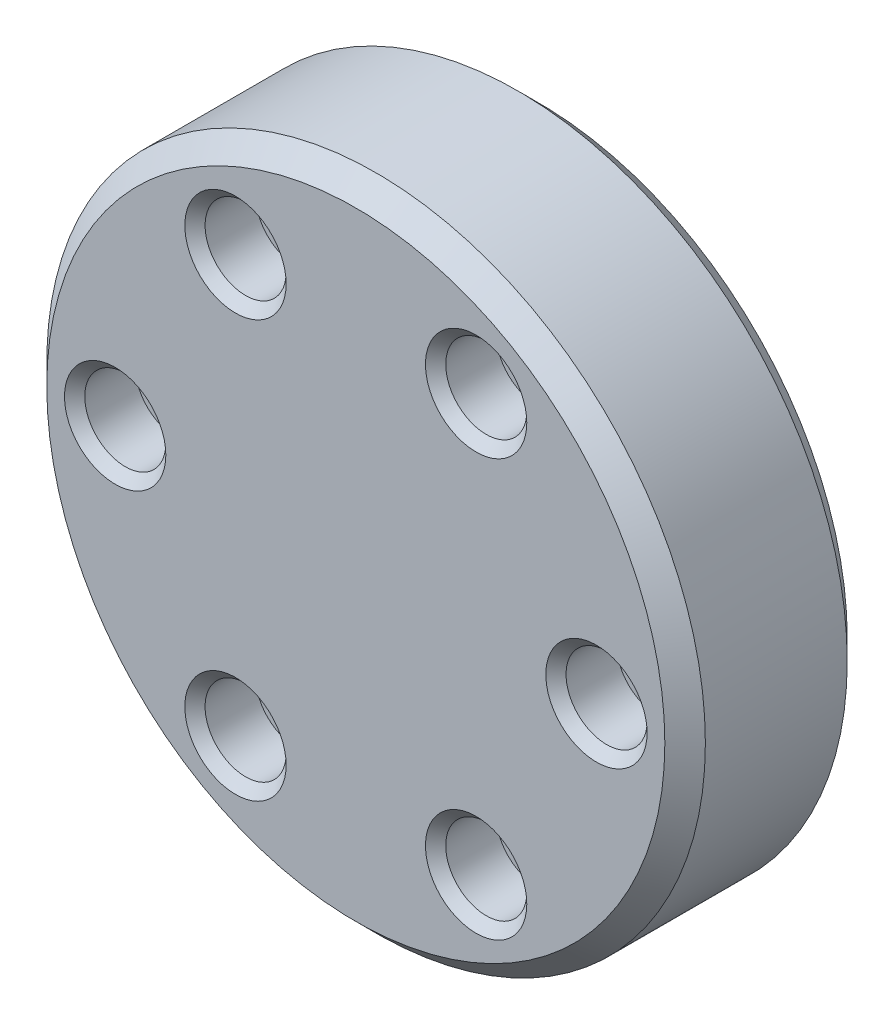
ISO-10303-21;
HEADER;
FILE_DESCRIPTION(('STEP AP214'),'2;1');
FILE_NAME('part.step','',(''),(''),'','','');
FILE_SCHEMA(('AUTOMOTIVE_DESIGN { 1 0 10303 214 1 1 1 1 }'));
ENDSEC;
DATA;
#1=APPLICATION_CONTEXT('core data for automotive mechanical design processes');
#2=APPLICATION_PROTOCOL_DEFINITION('international standard','automotive_design',2000,#1);
#3=PRODUCT_CONTEXT('',#1,'mechanical');
#4=PRODUCT('Part','Part','',(#3));
#5=PRODUCT_RELATED_PRODUCT_CATEGORY('part','',(#4));
#6=PRODUCT_DEFINITION_FORMATION('','',#4);
#7=PRODUCT_DEFINITION_CONTEXT('part definition',#1,'design');
#8=PRODUCT_DEFINITION('design','',#6,#7);
#9=PRODUCT_DEFINITION_SHAPE('','',#8);
#10=(LENGTH_UNIT() NAMED_UNIT(*) SI_UNIT(.MILLI.,.METRE.));
#11=(NAMED_UNIT(*) PLANE_ANGLE_UNIT() SI_UNIT($,.RADIAN.));
#12=(NAMED_UNIT(*) SI_UNIT($,.STERADIAN.) SOLID_ANGLE_UNIT());
#13=UNCERTAINTY_MEASURE_WITH_UNIT(LENGTH_MEASURE(1.E-05),#10,'distance_accuracy_value','');
#14=(GEOMETRIC_REPRESENTATION_CONTEXT(3) GLOBAL_UNCERTAINTY_ASSIGNED_CONTEXT((#13)) GLOBAL_UNIT_ASSIGNED_CONTEXT((#10,
#11,#12)) REPRESENTATION_CONTEXT('',''));
#15=CARTESIAN_POINT('',(0.,0.,0.));
#16=DIRECTION('',(0.,0.,1.));
#17=DIRECTION('',(1.,0.,0.));
#18=AXIS2_PLACEMENT_3D('',#15,#16,#17);
#19=CARTESIAN_POINT('',(-11.8749999999995,20.5681033398807,-9.));
#20=DIRECTION('',(0.,0.,1.));
#21=DIRECTION('',(1.,0.,0.));
#22=AXIS2_PLACEMENT_3D('',#19,#20,#21);
#23=CYLINDRICAL_SURFACE('',#22,2.6);
#24=CARTESIAN_POINT('',(-11.8749999999995,20.5681033398807,3.));
#25=DIRECTION('',(0.,0.,1.));
#26=DIRECTION('',(1.,0.,0.));
#27=AXIS2_PLACEMENT_3D('',#24,#25,#26);
#28=CIRCLE('',#27,2.6);
#29=CARTESIAN_POINT('',(-9.27499999999952,20.5681033398807,3.));
#30=VERTEX_POINT('',#29);
#31=EDGE_CURVE('E75',#30,#30,#28,.F.);
#32=ORIENTED_EDGE('',*,*,#31,.F.);
#33=EDGE_LOOP('',(#32));
#34=FACE_BOUND('',#33,.T.);
#35=CARTESIAN_POINT('',(-11.8749999999995,20.5681033398807,1.));
#36=DIRECTION('',(0.,0.,-1.));
#37=DIRECTION('',(-1.,0.,0.));
#38=AXIS2_PLACEMENT_3D('',#35,#36,#37);
#39=CIRCLE('',#38,2.6);
#40=CARTESIAN_POINT('',(-14.4749999999995,20.5681033398807,1.));
#41=VERTEX_POINT('',#40);
#42=EDGE_CURVE('E118',#41,#41,#39,.F.);
#43=ORIENTED_EDGE('',*,*,#42,.F.);
#44=EDGE_LOOP('',(#43));
#45=FACE_BOUND('',#44,.T.);
#46=ADVANCED_FACE('F35',(#34,#45),#23,.F.);
#47=CARTESIAN_POINT('',(-23.75,4.97865637605344E-13,-9.));
#48=DIRECTION('',(0.,0.,1.));
#49=DIRECTION('',(1.,0.,0.));
#50=AXIS2_PLACEMENT_3D('',#47,#48,#49);
#51=CYLINDRICAL_SURFACE('',#50,2.6);
#52=CARTESIAN_POINT('',(-23.75,4.97865637605344E-13,3.));
#53=DIRECTION('',(0.,0.,1.));
#54=DIRECTION('',(1.,0.,0.));
#55=AXIS2_PLACEMENT_3D('',#52,#53,#54);
#56=CIRCLE('',#55,2.6);
#57=CARTESIAN_POINT('',(-21.15,4.97865637605344E-13,3.));
#58=VERTEX_POINT('',#57);
#59=EDGE_CURVE('E79',#58,#58,#56,.F.);
#60=ORIENTED_EDGE('',*,*,#59,.F.);
#61=EDGE_LOOP('',(#60));
#62=FACE_BOUND('',#61,.T.);
#63=CARTESIAN_POINT('',(-23.75,4.97865637605344E-13,1.));
#64=DIRECTION('',(0.,0.,-1.));
#65=DIRECTION('',(-1.,0.,0.));
#66=AXIS2_PLACEMENT_3D('',#63,#64,#65);
#67=CIRCLE('',#66,2.6);
#68=CARTESIAN_POINT('',(-26.35,4.97865637605344E-13,1.));
#69=VERTEX_POINT('',#68);
#70=EDGE_CURVE('E131',#69,#69,#67,.F.);
#71=ORIENTED_EDGE('',*,*,#70,.F.);
#72=EDGE_LOOP('',(#71));
#73=FACE_BOUND('',#72,.T.);
#74=ADVANCED_FACE('F176',(#62,#73),#51,.F.);
#75=CARTESIAN_POINT('',(-11.8750000000002,-20.5681033398803,-9.));
#76=DIRECTION('',(0.,0.,1.));
#77=DIRECTION('',(1.,0.,0.));
#78=AXIS2_PLACEMENT_3D('',#75,#76,#77);
#79=CYLINDRICAL_SURFACE('',#78,2.6);
#80=CARTESIAN_POINT('',(-11.8750000000002,-20.5681033398803,3.));
#81=DIRECTION('',(0.,0.,1.));
#82=DIRECTION('',(1.,0.,0.));
#83=AXIS2_PLACEMENT_3D('',#80,#81,#82);
#84=CIRCLE('',#83,2.6);
#85=CARTESIAN_POINT('',(-9.27500000000024,-20.5681033398803,3.));
#86=VERTEX_POINT('',#85);
#87=EDGE_CURVE('E82',#86,#86,#84,.F.);
#88=ORIENTED_EDGE('',*,*,#87,.F.);
#89=EDGE_LOOP('',(#88));
#90=FACE_BOUND('',#89,.T.);
#91=CARTESIAN_POINT('',(-11.8750000000002,-20.5681033398803,1.));
#92=DIRECTION('',(0.,0.,-1.));
#93=DIRECTION('',(-1.,0.,0.));
#94=AXIS2_PLACEMENT_3D('',#91,#92,#93);
#95=CIRCLE('',#94,2.6);
#96=CARTESIAN_POINT('',(-14.4750000000002,-20.5681033398803,1.));
#97=VERTEX_POINT('',#96);
#98=EDGE_CURVE('E134',#97,#97,#95,.F.);
#99=ORIENTED_EDGE('',*,*,#98,.F.);
#100=EDGE_LOOP('',(#99));
#101=FACE_BOUND('',#100,.T.);
#102=ADVANCED_FACE('F182',(#90,#101),#79,.F.);
#103=CARTESIAN_POINT('',(11.8749999999997,-20.5681033398806,-9.));
#104=DIRECTION('',(0.,0.,1.));
#105=DIRECTION('',(1.,0.,0.));
#106=AXIS2_PLACEMENT_3D('',#103,#104,#105);
#107=CYLINDRICAL_SURFACE('',#106,2.6);
#108=CARTESIAN_POINT('',(11.8749999999997,-20.5681033398806,3.));
#109=DIRECTION('',(0.,0.,1.));
#110=DIRECTION('',(1.,0.,0.));
#111=AXIS2_PLACEMENT_3D('',#108,#109,#110);
#112=CIRCLE('',#111,2.6);
#113=CARTESIAN_POINT('',(14.4749999999997,-20.5681033398806,3.));
#114=VERTEX_POINT('',#113);
#115=EDGE_CURVE('E85',#114,#114,#112,.F.);
#116=ORIENTED_EDGE('',*,*,#115,.F.);
#117=EDGE_LOOP('',(#116));
#118=FACE_BOUND('',#117,.T.);
#119=CARTESIAN_POINT('',(11.8749999999997,-20.5681033398806,1.));
#120=DIRECTION('',(0.,0.,-1.));
#121=DIRECTION('',(-1.,0.,0.));
#122=AXIS2_PLACEMENT_3D('',#119,#120,#121);
#123=CIRCLE('',#122,2.6);
#124=CARTESIAN_POINT('',(9.27499999999966,-20.5681033398806,1.));
#125=VERTEX_POINT('',#124);
#126=EDGE_CURVE('E137',#125,#125,#123,.F.);
#127=ORIENTED_EDGE('',*,*,#126,.F.);
#128=EDGE_LOOP('',(#127));
#129=FACE_BOUND('',#128,.T.);
#130=ADVANCED_FACE('F169',(#118,#129),#107,.F.);
#131=CARTESIAN_POINT('',(23.75,-3.34801630863524E-13,-9.));
#132=DIRECTION('',(0.,0.,1.));
#133=DIRECTION('',(1.,0.,0.));
#134=AXIS2_PLACEMENT_3D('',#131,#132,#133);
#135=CYLINDRICAL_SURFACE('',#134,2.6);
#136=CARTESIAN_POINT('',(23.75,-3.34801630863524E-13,3.));
#137=DIRECTION('',(0.,0.,1.));
#138=DIRECTION('',(1.,0.,0.));
#139=AXIS2_PLACEMENT_3D('',#136,#137,#138);
#140=CIRCLE('',#139,2.6);
#141=CARTESIAN_POINT('',(26.35,-3.34801630863524E-13,3.));
#142=VERTEX_POINT('',#141);
#143=EDGE_CURVE('E88',#142,#142,#140,.F.);
#144=ORIENTED_EDGE('',*,*,#143,.F.);
#145=EDGE_LOOP('',(#144));
#146=FACE_BOUND('',#145,.T.);
#147=CARTESIAN_POINT('',(23.75,-3.34801630863524E-13,1.));
#148=DIRECTION('',(0.,0.,-1.));
#149=DIRECTION('',(-1.,0.,0.));
#150=AXIS2_PLACEMENT_3D('',#147,#148,#149);
#151=CIRCLE('',#150,2.6);
#152=CARTESIAN_POINT('',(21.15,-3.34801630863524E-13,1.));
#153=VERTEX_POINT('',#152);
#154=EDGE_CURVE('E140',#153,#153,#151,.F.);
#155=ORIENTED_EDGE('',*,*,#154,.F.);
#156=EDGE_LOOP('',(#155));
#157=FACE_BOUND('',#156,.T.);
#158=ADVANCED_FACE('F159',(#146,#157),#135,.F.);
#159=CARTESIAN_POINT('',(11.8750000000002,20.5681033398803,-9.));
#160=DIRECTION('',(0.,0.,1.));
#161=DIRECTION('',(1.,0.,0.));
#162=AXIS2_PLACEMENT_3D('',#159,#160,#161);
#163=CYLINDRICAL_SURFACE('',#162,2.6);
#164=CARTESIAN_POINT('',(11.8750000000002,20.5681033398803,3.));
#165=DIRECTION('',(0.,0.,1.));
#166=DIRECTION('',(1.,0.,0.));
#167=AXIS2_PLACEMENT_3D('',#164,#165,#166);
#168=CIRCLE('',#167,2.6);
#169=CARTESIAN_POINT('',(14.4750000000002,20.5681033398803,3.));
#170=VERTEX_POINT('',#169);
#171=EDGE_CURVE('E98',#170,#170,#168,.F.);
#172=ORIENTED_EDGE('',*,*,#171,.F.);
#173=EDGE_LOOP('',(#172));
#174=FACE_BOUND('',#173,.T.);
#175=CARTESIAN_POINT('',(11.8750000000002,20.5681033398803,1.));
#176=DIRECTION('',(0.,0.,-1.));
#177=DIRECTION('',(-1.,0.,0.));
#178=AXIS2_PLACEMENT_3D('',#175,#176,#177);
#179=CIRCLE('',#178,2.6);
#180=CARTESIAN_POINT('',(9.27500000000024,20.5681033398803,1.));
#181=VERTEX_POINT('',#180);
#182=EDGE_CURVE('E40',#181,#181,#179,.F.);
#183=ORIENTED_EDGE('',*,*,#182,.F.);
#184=EDGE_LOOP('',(#183));
#185=FACE_BOUND('',#184,.T.);
#186=ADVANCED_FACE('F156',(#174,#185),#163,.F.);
#187=CARTESIAN_POINT('',(0.,0.,9.));
#188=DIRECTION('',(0.,0.,-1.));
#189=DIRECTION('',(-1.,0.,0.));
#190=AXIS2_PLACEMENT_3D('',#187,#188,#189);
#191=CYLINDRICAL_SURFACE('',#190,32.5);
#192=CARTESIAN_POINT('',(0.,0.,-7.));
#193=DIRECTION('',(0.,0.,1.));
#194=DIRECTION('',(1.,0.,0.));
#195=AXIS2_PLACEMENT_3D('',#192,#193,#194);
#196=CIRCLE('',#195,32.5);
#197=CARTESIAN_POINT('',(32.5,0.,-7.));
#198=VERTEX_POINT('',#197);
#199=EDGE_CURVE('E107',#198,#198,#196,.T.);
#200=ORIENTED_EDGE('',*,*,#199,.T.);
#201=EDGE_LOOP('',(#200));
#202=FACE_BOUND('',#201,.T.);
#203=CARTESIAN_POINT('',(0.,0.,7.00000000000002));
#204=DIRECTION('',(0.,0.,1.));
#205=DIRECTION('',(1.,0.,0.));
#206=AXIS2_PLACEMENT_3D('',#203,#204,#205);
#207=CIRCLE('',#206,32.5);
#208=CARTESIAN_POINT('',(32.5,0.,7.00000000000002));
#209=VERTEX_POINT('',#208);
#210=EDGE_CURVE('E101',#209,#209,#207,.F.);
#211=ORIENTED_EDGE('',*,*,#210,.T.);
#212=EDGE_LOOP('',(#211));
#213=FACE_BOUND('',#212,.T.);
#214=ADVANCED_FACE('F158',(#202,#213),#191,.T.);
#215=CARTESIAN_POINT('',(0.,0.,9.));
#216=DIRECTION('',(0.,0.,1.));
#217=DIRECTION('',(1.,0.,0.));
#218=AXIS2_PLACEMENT_3D('',#215,#216,#217);
#219=PLANE('',#218);
#220=CARTESIAN_POINT('',(-11.8749999999995,20.5681033398807,9.));
#221=DIRECTION('',(0.,0.,1.));
#222=DIRECTION('',(1.,0.,0.));
#223=AXIS2_PLACEMENT_3D('',#220,#221,#222);
#224=CIRCLE('',#223,4.99999999999999);
#225=CARTESIAN_POINT('',(-6.87499999999953,20.5681033398807,9.));
#226=VERTEX_POINT('',#225);
#227=EDGE_CURVE('E10',#226,#226,#224,.F.);
#228=ORIENTED_EDGE('',*,*,#227,.T.);
#229=EDGE_LOOP('',(#228));
#230=FACE_BOUND('',#229,.T.);
#231=CARTESIAN_POINT('',(-23.75,4.97865637605344E-13,9.));
#232=DIRECTION('',(0.,0.,1.));
#233=DIRECTION('',(1.,0.,0.));
#234=AXIS2_PLACEMENT_3D('',#231,#232,#233);
#235=CIRCLE('',#234,4.99999999999999);
#236=CARTESIAN_POINT('',(-18.75,4.97865637605344E-13,9.));
#237=VERTEX_POINT('',#236);
#238=EDGE_CURVE('E48',#237,#237,#235,.F.);
#239=ORIENTED_EDGE('',*,*,#238,.T.);
#240=EDGE_LOOP('',(#239));
#241=FACE_BOUND('',#240,.T.);
#242=CARTESIAN_POINT('',(-11.8750000000002,-20.5681033398803,9.));
#243=DIRECTION('',(0.,0.,1.));
#244=DIRECTION('',(1.,0.,0.));
#245=AXIS2_PLACEMENT_3D('',#242,#243,#244);
#246=CIRCLE('',#245,4.99999999999999);
#247=CARTESIAN_POINT('',(-6.87500000000025,-20.5681033398803,9.));
#248=VERTEX_POINT('',#247);
#249=EDGE_CURVE('E56',#248,#248,#246,.F.);
#250=ORIENTED_EDGE('',*,*,#249,.T.);
#251=EDGE_LOOP('',(#250));
#252=FACE_BOUND('',#251,.T.);
#253=CARTESIAN_POINT('',(11.8749999999997,-20.5681033398806,9.));
#254=DIRECTION('',(0.,0.,1.));
#255=DIRECTION('',(1.,0.,0.));
#256=AXIS2_PLACEMENT_3D('',#253,#254,#255);
#257=CIRCLE('',#256,4.99999999999999);
#258=CARTESIAN_POINT('',(16.8749999999997,-20.5681033398806,9.));
#259=VERTEX_POINT('',#258);
#260=EDGE_CURVE('E62',#259,#259,#257,.F.);
#261=ORIENTED_EDGE('',*,*,#260,.T.);
#262=EDGE_LOOP('',(#261));
#263=FACE_BOUND('',#262,.T.);
#264=CARTESIAN_POINT('',(23.75,-3.34801630863524E-13,9.));
#265=DIRECTION('',(0.,0.,1.));
#266=DIRECTION('',(1.,0.,0.));
#267=AXIS2_PLACEMENT_3D('',#264,#265,#266);
#268=CIRCLE('',#267,4.99999999999999);
#269=CARTESIAN_POINT('',(28.75,-3.34801630863524E-13,9.));
#270=VERTEX_POINT('',#269);
#271=EDGE_CURVE('E68',#270,#270,#268,.F.);
#272=ORIENTED_EDGE('',*,*,#271,.T.);
#273=EDGE_LOOP('',(#272));
#274=FACE_BOUND('',#273,.T.);
#275=CARTESIAN_POINT('',(11.8750000000002,20.5681033398803,9.));
#276=DIRECTION('',(0.,0.,1.));
#277=DIRECTION('',(1.,0.,0.));
#278=AXIS2_PLACEMENT_3D('',#275,#276,#277);
#279=CIRCLE('',#278,4.99999999999999);
#280=CARTESIAN_POINT('',(16.8750000000002,20.5681033398803,9.));
#281=VERTEX_POINT('',#280);
#282=EDGE_CURVE('E74',#281,#281,#279,.F.);
#283=ORIENTED_EDGE('',*,*,#282,.T.);
#284=EDGE_LOOP('',(#283));
#285=FACE_BOUND('',#284,.T.);
#286=CARTESIAN_POINT('',(0.,0.,9.));
#287=DIRECTION('',(0.,0.,1.));
#288=DIRECTION('',(1.,0.,0.));
#289=AXIS2_PLACEMENT_3D('',#286,#287,#288);
#290=CIRCLE('',#289,30.5);
#291=CARTESIAN_POINT('',(30.5,0.,9.));
#292=VERTEX_POINT('',#291);
#293=EDGE_CURVE('E97',#292,#292,#290,.T.);
#294=ORIENTED_EDGE('',*,*,#293,.T.);
#295=EDGE_LOOP('',(#294));
#296=FACE_BOUND('',#295,.T.);
#297=ADVANCED_FACE('F166',(#230,#241,#252,#263,#274,#285,#296),#219,.T.);
#298=CARTESIAN_POINT('',(0.,0.,-9.));
#299=DIRECTION('',(0.,0.,1.));
#300=DIRECTION('',(1.,0.,0.));
#301=AXIS2_PLACEMENT_3D('',#298,#299,#300);
#302=PLANE('',#301);
#303=CARTESIAN_POINT('',(0.,0.,-9.));
#304=DIRECTION('',(0.,0.,-1.));
#305=DIRECTION('',(-1.,0.,0.));
#306=AXIS2_PLACEMENT_3D('',#303,#304,#305);
#307=CIRCLE('',#306,28.4);
#308=CARTESIAN_POINT('',(-28.4,0.,-9.));
#309=VERTEX_POINT('',#308);
#310=EDGE_CURVE('E143',#309,#309,#307,.T.);
#311=ORIENTED_EDGE('',*,*,#310,.F.);
#312=EDGE_LOOP('',(#311));
#313=FACE_BOUND('',#312,.T.);
#314=CARTESIAN_POINT('',(0.,0.,-9.));
#315=DIRECTION('',(0.,0.,1.));
#316=DIRECTION('',(1.,0.,0.));
#317=AXIS2_PLACEMENT_3D('',#314,#315,#316);
#318=CIRCLE('',#317,30.5);
#319=CARTESIAN_POINT('',(30.5,0.,-9.));
#320=VERTEX_POINT('',#319);
#321=EDGE_CURVE('E104',#320,#320,#318,.F.);
#322=ORIENTED_EDGE('',*,*,#321,.T.);
#323=EDGE_LOOP('',(#322));
#324=FACE_BOUND('',#323,.T.);
#325=ADVANCED_FACE('F339',(#313,#324),#302,.F.);
#326=CARTESIAN_POINT('',(0.,0.,-7.));
#327=DIRECTION('',(0.,0.,1.));
#328=DIRECTION('',(1.,0.,0.));
#329=AXIS2_PLACEMENT_3D('',#326,#327,#328);
#330=CONICAL_SURFACE('',#329,32.5,0.785398163397452);
#331=ORIENTED_EDGE('',*,*,#321,.F.);
#332=EDGE_LOOP('',(#331));
#333=FACE_BOUND('',#332,.T.);
#334=ORIENTED_EDGE('',*,*,#199,.F.);
#335=EDGE_LOOP('',(#334));
#336=FACE_BOUND('',#335,.T.);
#337=ADVANCED_FACE('F343',(#333,#336),#330,.T.);
#338=CARTESIAN_POINT('',(0.,0.,9.));
#339=DIRECTION('',(0.,0.,-1.));
#340=DIRECTION('',(-1.,0.,0.));
#341=AXIS2_PLACEMENT_3D('',#338,#339,#340);
#342=CONICAL_SURFACE('',#341,30.5,0.785398163397445);
#343=ORIENTED_EDGE('',*,*,#210,.F.);
#344=EDGE_LOOP('',(#343));
#345=FACE_BOUND('',#344,.T.);
#346=ORIENTED_EDGE('',*,*,#293,.F.);
#347=EDGE_LOOP('',(#346));
#348=FACE_BOUND('',#347,.T.);
#349=ADVANCED_FACE('F192',(#345,#348),#342,.T.);
#350=CARTESIAN_POINT('',(11.8750000000002,20.5681033398803,3.));
#351=DIRECTION('',(0.,0.,1.));
#352=DIRECTION('',(1.,0.,0.));
#353=AXIS2_PLACEMENT_3D('',#350,#351,#352);
#354=PLANE('',#353);
#355=CARTESIAN_POINT('',(11.8750000000002,20.5681033398803,3.));
#356=DIRECTION('',(0.,0.,1.));
#357=DIRECTION('',(1.,0.,0.));
#358=AXIS2_PLACEMENT_3D('',#355,#356,#357);
#359=CIRCLE('',#358,4.);
#360=CARTESIAN_POINT('',(15.8750000000002,20.5681033398803,3.));
#361=VERTEX_POINT('',#360);
#362=EDGE_CURVE('E78',#361,#361,#359,.T.);
#363=ORIENTED_EDGE('',*,*,#362,.T.);
#364=EDGE_LOOP('',(#363));
#365=FACE_BOUND('',#364,.T.);
#366=ORIENTED_EDGE('',*,*,#171,.T.);
#367=EDGE_LOOP('',(#366));
#368=FACE_BOUND('',#367,.T.);
#369=ADVANCED_FACE('F189',(#365,#368),#354,.T.);
#370=CARTESIAN_POINT('',(11.8750000000002,20.5681033398803,3.));
#371=DIRECTION('',(0.,0.,1.));
#372=DIRECTION('',(1.,0.,0.));
#373=AXIS2_PLACEMENT_3D('',#370,#371,#372);
#374=CYLINDRICAL_SURFACE('',#373,4.);
#375=CARTESIAN_POINT('',(11.8750000000002,20.5681033398803,8.00000000000001));
#376=DIRECTION('',(0.,0.,1.));
#377=DIRECTION('',(1.,0.,0.));
#378=AXIS2_PLACEMENT_3D('',#375,#376,#377);
#379=CIRCLE('',#378,4.);
#380=CARTESIAN_POINT('',(15.8750000000002,20.5681033398803,8.00000000000001));
#381=VERTEX_POINT('',#380);
#382=EDGE_CURVE('E94',#381,#381,#379,.T.);
#383=ORIENTED_EDGE('',*,*,#382,.T.);
#384=EDGE_LOOP('',(#383));
#385=FACE_BOUND('',#384,.T.);
#386=ORIENTED_EDGE('',*,*,#362,.F.);
#387=EDGE_LOOP('',(#386));
#388=FACE_BOUND('',#387,.T.);
#389=ADVANCED_FACE('F191',(#385,#388),#374,.F.);
#390=CARTESIAN_POINT('',(11.8750000000002,20.5681033398803,8.00000000000001));
#391=DIRECTION('',(0.,0.,1.));
#392=DIRECTION('',(1.,0.,0.));
#393=AXIS2_PLACEMENT_3D('',#390,#391,#392);
#394=CONICAL_SURFACE('',#393,4.,0.785398163397448);
#395=ORIENTED_EDGE('',*,*,#282,.F.);
#396=EDGE_LOOP('',(#395));
#397=FACE_BOUND('',#396,.T.);
#398=ORIENTED_EDGE('',*,*,#382,.F.);
#399=EDGE_LOOP('',(#398));
#400=FACE_BOUND('',#399,.T.);
#401=ADVANCED_FACE('F195',(#397,#400),#394,.F.);
#402=CARTESIAN_POINT('',(23.75,-3.34801630863524E-13,3.));
#403=DIRECTION('',(0.,0.,1.));
#404=DIRECTION('',(1.,0.,0.));
#405=AXIS2_PLACEMENT_3D('',#402,#403,#404);
#406=PLANE('',#405);
#407=CARTESIAN_POINT('',(23.75,-3.34801630863524E-13,3.));
#408=DIRECTION('',(0.,0.,1.));
#409=DIRECTION('',(1.,0.,0.));
#410=AXIS2_PLACEMENT_3D('',#407,#408,#409);
#411=CIRCLE('',#410,4.);
#412=CARTESIAN_POINT('',(27.75,-3.34801630863524E-13,3.));
#413=VERTEX_POINT('',#412);
#414=EDGE_CURVE('E91',#413,#413,#411,.T.);
#415=ORIENTED_EDGE('',*,*,#414,.T.);
#416=EDGE_LOOP('',(#415));
#417=FACE_BOUND('',#416,.T.);
#418=ORIENTED_EDGE('',*,*,#143,.T.);
#419=EDGE_LOOP('',(#418));
#420=FACE_BOUND('',#419,.T.);
#421=ADVANCED_FACE('F200',(#417,#420),#406,.T.);
#422=CARTESIAN_POINT('',(23.75,-3.34801630863524E-13,3.));
#423=DIRECTION('',(0.,0.,1.));
#424=DIRECTION('',(1.,0.,0.));
#425=AXIS2_PLACEMENT_3D('',#422,#423,#424);
#426=CYLINDRICAL_SURFACE('',#425,4.);
#427=CARTESIAN_POINT('',(23.75,-3.34801630863524E-13,8.00000000000001));
#428=DIRECTION('',(0.,0.,1.));
#429=DIRECTION('',(1.,0.,0.));
#430=AXIS2_PLACEMENT_3D('',#427,#428,#429);
#431=CIRCLE('',#430,4.);
#432=CARTESIAN_POINT('',(27.75,-3.34801630863524E-13,8.00000000000001));
#433=VERTEX_POINT('',#432);
#434=EDGE_CURVE('E71',#433,#433,#431,.T.);
#435=ORIENTED_EDGE('',*,*,#434,.T.);
#436=EDGE_LOOP('',(#435));
#437=FACE_BOUND('',#436,.T.);
#438=ORIENTED_EDGE('',*,*,#414,.F.);
#439=EDGE_LOOP('',(#438));
#440=FACE_BOUND('',#439,.T.);
#441=ADVANCED_FACE('F211',(#437,#440),#426,.F.);
#442=CARTESIAN_POINT('',(11.8749999999997,-20.5681033398806,3.));
#443=DIRECTION('',(0.,0.,1.));
#444=DIRECTION('',(1.,0.,0.));
#445=AXIS2_PLACEMENT_3D('',#442,#443,#444);
#446=PLANE('',#445);
#447=CARTESIAN_POINT('',(11.8749999999997,-20.5681033398806,3.));
#448=DIRECTION('',(0.,0.,1.));
#449=DIRECTION('',(1.,0.,0.));
#450=AXIS2_PLACEMENT_3D('',#447,#448,#449);
#451=CIRCLE('',#450,4.);
#452=CARTESIAN_POINT('',(15.8749999999997,-20.5681033398806,3.));
#453=VERTEX_POINT('',#452);
#454=EDGE_CURVE('E124',#453,#453,#451,.T.);
#455=ORIENTED_EDGE('',*,*,#454,.T.);
#456=EDGE_LOOP('',(#455));
#457=FACE_BOUND('',#456,.T.);
#458=ORIENTED_EDGE('',*,*,#115,.T.);
#459=EDGE_LOOP('',(#458));
#460=FACE_BOUND('',#459,.T.);
#461=ADVANCED_FACE('F286',(#457,#460),#446,.T.);
#462=CARTESIAN_POINT('',(11.8749999999997,-20.5681033398806,3.));
#463=DIRECTION('',(0.,0.,1.));
#464=DIRECTION('',(1.,0.,0.));
#465=AXIS2_PLACEMENT_3D('',#462,#463,#464);
#466=CYLINDRICAL_SURFACE('',#465,4.);
#467=CARTESIAN_POINT('',(11.8749999999997,-20.5681033398806,8.00000000000001));
#468=DIRECTION('',(0.,0.,1.));
#469=DIRECTION('',(1.,0.,0.));
#470=AXIS2_PLACEMENT_3D('',#467,#468,#469);
#471=CIRCLE('',#470,4.);
#472=CARTESIAN_POINT('',(15.8749999999997,-20.5681033398806,8.00000000000001));
#473=VERTEX_POINT('',#472);
#474=EDGE_CURVE('E65',#473,#473,#471,.T.);
#475=ORIENTED_EDGE('',*,*,#474,.T.);
#476=EDGE_LOOP('',(#475));
#477=FACE_BOUND('',#476,.T.);
#478=ORIENTED_EDGE('',*,*,#454,.F.);
#479=EDGE_LOOP('',(#478));
#480=FACE_BOUND('',#479,.T.);
#481=ADVANCED_FACE('F290',(#477,#480),#466,.F.);
#482=CARTESIAN_POINT('',(-11.8750000000002,-20.5681033398803,3.));
#483=DIRECTION('',(0.,0.,1.));
#484=DIRECTION('',(1.,0.,0.));
#485=AXIS2_PLACEMENT_3D('',#482,#483,#484);
#486=PLANE('',#485);
#487=CARTESIAN_POINT('',(-11.8750000000002,-20.5681033398803,3.));
#488=DIRECTION('',(0.,0.,1.));
#489=DIRECTION('',(1.,0.,0.));
#490=AXIS2_PLACEMENT_3D('',#487,#488,#489);
#491=CIRCLE('',#490,4.);
#492=CARTESIAN_POINT('',(-7.87500000000024,-20.5681033398803,3.));
#493=VERTEX_POINT('',#492);
#494=EDGE_CURVE('E121',#493,#493,#491,.T.);
#495=ORIENTED_EDGE('',*,*,#494,.T.);
#496=EDGE_LOOP('',(#495));
#497=FACE_BOUND('',#496,.T.);
#498=ORIENTED_EDGE('',*,*,#87,.T.);
#499=EDGE_LOOP('',(#498));
#500=FACE_BOUND('',#499,.T.);
#501=ADVANCED_FACE('F294',(#497,#500),#486,.T.);
#502=CARTESIAN_POINT('',(-11.8750000000002,-20.5681033398803,3.));
#503=DIRECTION('',(0.,0.,1.));
#504=DIRECTION('',(1.,0.,0.));
#505=AXIS2_PLACEMENT_3D('',#502,#503,#504);
#506=CYLINDRICAL_SURFACE('',#505,4.);
#507=CARTESIAN_POINT('',(-11.8750000000002,-20.5681033398803,8.00000000000001));
#508=DIRECTION('',(0.,0.,1.));
#509=DIRECTION('',(1.,0.,0.));
#510=AXIS2_PLACEMENT_3D('',#507,#508,#509);
#511=CIRCLE('',#510,4.);
#512=CARTESIAN_POINT('',(-7.87500000000024,-20.5681033398803,8.00000000000001));
#513=VERTEX_POINT('',#512);
#514=EDGE_CURVE('E59',#513,#513,#511,.T.);
#515=ORIENTED_EDGE('',*,*,#514,.T.);
#516=EDGE_LOOP('',(#515));
#517=FACE_BOUND('',#516,.T.);
#518=ORIENTED_EDGE('',*,*,#494,.F.);
#519=EDGE_LOOP('',(#518));
#520=FACE_BOUND('',#519,.T.);
#521=ADVANCED_FACE('F267',(#517,#520),#506,.F.);
#522=CARTESIAN_POINT('',(-23.75,4.97865637605344E-13,3.));
#523=DIRECTION('',(0.,0.,1.));
#524=DIRECTION('',(1.,0.,0.));
#525=AXIS2_PLACEMENT_3D('',#522,#523,#524);
#526=PLANE('',#525);
#527=CARTESIAN_POINT('',(-23.75,4.97865637605344E-13,3.));
#528=DIRECTION('',(0.,0.,1.));
#529=DIRECTION('',(1.,0.,0.));
#530=AXIS2_PLACEMENT_3D('',#527,#528,#529);
#531=CIRCLE('',#530,4.);
#532=CARTESIAN_POINT('',(-19.75,4.97865637605344E-13,3.));
#533=VERTEX_POINT('',#532);
#534=EDGE_CURVE('E117',#533,#533,#531,.T.);
#535=ORIENTED_EDGE('',*,*,#534,.T.);
#536=EDGE_LOOP('',(#535));
#537=FACE_BOUND('',#536,.T.);
#538=ORIENTED_EDGE('',*,*,#59,.T.);
#539=EDGE_LOOP('',(#538));
#540=FACE_BOUND('',#539,.T.);
#541=ADVANCED_FACE('F261',(#537,#540),#526,.T.);
#542=CARTESIAN_POINT('',(-23.75,4.97865637605344E-13,3.));
#543=DIRECTION('',(0.,0.,1.));
#544=DIRECTION('',(1.,0.,0.));
#545=AXIS2_PLACEMENT_3D('',#542,#543,#544);
#546=CYLINDRICAL_SURFACE('',#545,4.);
#547=CARTESIAN_POINT('',(-23.75,4.97865637605344E-13,8.00000000000001));
#548=DIRECTION('',(0.,0.,1.));
#549=DIRECTION('',(1.,0.,0.));
#550=AXIS2_PLACEMENT_3D('',#547,#548,#549);
#551=CIRCLE('',#550,4.);
#552=CARTESIAN_POINT('',(-19.75,4.97865637605344E-13,8.00000000000001));
#553=VERTEX_POINT('',#552);
#554=EDGE_CURVE('E53',#553,#553,#551,.T.);
#555=ORIENTED_EDGE('',*,*,#554,.T.);
#556=EDGE_LOOP('',(#555));
#557=FACE_BOUND('',#556,.T.);
#558=ORIENTED_EDGE('',*,*,#534,.F.);
#559=EDGE_LOOP('',(#558));
#560=FACE_BOUND('',#559,.T.);
#561=ADVANCED_FACE('F257',(#557,#560),#546,.F.);
#562=CARTESIAN_POINT('',(-11.8749999999995,20.5681033398807,3.));
#563=DIRECTION('',(0.,0.,1.));
#564=DIRECTION('',(1.,0.,0.));
#565=AXIS2_PLACEMENT_3D('',#562,#563,#564);
#566=PLANE('',#565);
#567=CARTESIAN_POINT('',(-11.8749999999995,20.5681033398807,3.));
#568=DIRECTION('',(0.,0.,1.));
#569=DIRECTION('',(1.,0.,0.));
#570=AXIS2_PLACEMENT_3D('',#567,#568,#569);
#571=CIRCLE('',#570,4.);
#572=CARTESIAN_POINT('',(-7.87499999999952,20.5681033398807,3.));
#573=VERTEX_POINT('',#572);
#574=EDGE_CURVE('E114',#573,#573,#571,.T.);
#575=ORIENTED_EDGE('',*,*,#574,.T.);
#576=EDGE_LOOP('',(#575));
#577=FACE_BOUND('',#576,.T.);
#578=ORIENTED_EDGE('',*,*,#31,.T.);
#579=EDGE_LOOP('',(#578));
#580=FACE_BOUND('',#579,.T.);
#581=ADVANCED_FACE('F260',(#577,#580),#566,.T.);
#582=CARTESIAN_POINT('',(-11.8749999999995,20.5681033398807,3.));
#583=DIRECTION('',(0.,0.,1.));
#584=DIRECTION('',(1.,0.,0.));
#585=AXIS2_PLACEMENT_3D('',#582,#583,#584);
#586=CYLINDRICAL_SURFACE('',#585,4.);
#587=CARTESIAN_POINT('',(-11.8749999999995,20.5681033398807,8.00000000000001));
#588=DIRECTION('',(0.,0.,1.));
#589=DIRECTION('',(1.,0.,0.));
#590=AXIS2_PLACEMENT_3D('',#587,#588,#589);
#591=CIRCLE('',#590,4.);
#592=CARTESIAN_POINT('',(-7.87499999999952,20.5681033398807,8.00000000000001));
#593=VERTEX_POINT('',#592);
#594=EDGE_CURVE('E44',#593,#593,#591,.T.);
#595=ORIENTED_EDGE('',*,*,#594,.T.);
#596=EDGE_LOOP('',(#595));
#597=FACE_BOUND('',#596,.T.);
#598=ORIENTED_EDGE('',*,*,#574,.F.);
#599=EDGE_LOOP('',(#598));
#600=FACE_BOUND('',#599,.T.);
#601=ADVANCED_FACE('F230',(#597,#600),#586,.F.);
#602=CARTESIAN_POINT('',(23.75,-3.34801630863524E-13,8.00000000000001));
#603=DIRECTION('',(0.,0.,1.));
#604=DIRECTION('',(1.,0.,0.));
#605=AXIS2_PLACEMENT_3D('',#602,#603,#604);
#606=CONICAL_SURFACE('',#605,4.,0.785398163397449);
#607=ORIENTED_EDGE('',*,*,#271,.F.);
#608=EDGE_LOOP('',(#607));
#609=FACE_BOUND('',#608,.T.);
#610=ORIENTED_EDGE('',*,*,#434,.F.);
#611=EDGE_LOOP('',(#610));
#612=FACE_BOUND('',#611,.T.);
#613=ADVANCED_FACE('F223',(#609,#612),#606,.F.);
#614=CARTESIAN_POINT('',(11.8749999999997,-20.5681033398806,8.00000000000001));
#615=DIRECTION('',(0.,0.,1.));
#616=DIRECTION('',(1.,0.,0.));
#617=AXIS2_PLACEMENT_3D('',#614,#615,#616);
#618=CONICAL_SURFACE('',#617,4.,0.785398163397448);
#619=ORIENTED_EDGE('',*,*,#260,.F.);
#620=EDGE_LOOP('',(#619));
#621=FACE_BOUND('',#620,.T.);
#622=ORIENTED_EDGE('',*,*,#474,.F.);
#623=EDGE_LOOP('',(#622));
#624=FACE_BOUND('',#623,.T.);
#625=ADVANCED_FACE('F229',(#621,#624),#618,.F.);
#626=CARTESIAN_POINT('',(-11.8750000000002,-20.5681033398803,8.00000000000001));
#627=DIRECTION('',(0.,0.,1.));
#628=DIRECTION('',(1.,0.,0.));
#629=AXIS2_PLACEMENT_3D('',#626,#627,#628);
#630=CONICAL_SURFACE('',#629,4.,0.785398163397449);
#631=ORIENTED_EDGE('',*,*,#249,.F.);
#632=EDGE_LOOP('',(#631));
#633=FACE_BOUND('',#632,.T.);
#634=ORIENTED_EDGE('',*,*,#514,.F.);
#635=EDGE_LOOP('',(#634));
#636=FACE_BOUND('',#635,.T.);
#637=ADVANCED_FACE('F237',(#633,#636),#630,.F.);
#638=CARTESIAN_POINT('',(-23.75,4.97865637605344E-13,8.00000000000001));
#639=DIRECTION('',(0.,0.,1.));
#640=DIRECTION('',(1.,0.,0.));
#641=AXIS2_PLACEMENT_3D('',#638,#639,#640);
#642=CONICAL_SURFACE('',#641,4.,0.785398163397449);
#643=ORIENTED_EDGE('',*,*,#238,.F.);
#644=EDGE_LOOP('',(#643));
#645=FACE_BOUND('',#644,.T.);
#646=ORIENTED_EDGE('',*,*,#554,.F.);
#647=EDGE_LOOP('',(#646));
#648=FACE_BOUND('',#647,.T.);
#649=ADVANCED_FACE('F243',(#645,#648),#642,.F.);
#650=CARTESIAN_POINT('',(-11.8749999999995,20.5681033398807,8.00000000000001));
#651=DIRECTION('',(0.,0.,1.));
#652=DIRECTION('',(1.,0.,0.));
#653=AXIS2_PLACEMENT_3D('',#650,#651,#652);
#654=CONICAL_SURFACE('',#653,4.,0.785398163397449);
#655=ORIENTED_EDGE('',*,*,#227,.F.);
#656=EDGE_LOOP('',(#655));
#657=FACE_BOUND('',#656,.T.);
#658=ORIENTED_EDGE('',*,*,#594,.F.);
#659=EDGE_LOOP('',(#658));
#660=FACE_BOUND('',#659,.T.);
#661=ADVANCED_FACE('F38',(#657,#660),#654,.F.);
#662=CARTESIAN_POINT('',(0.,0.,1.));
#663=DIRECTION('',(0.,0.,-1.));
#664=DIRECTION('',(-1.,0.,0.));
#665=AXIS2_PLACEMENT_3D('',#662,#663,#664);
#666=PLANE('',#665);
#667=CARTESIAN_POINT('',(0.,0.,1.));
#668=DIRECTION('',(0.,0.,-1.));
#669=DIRECTION('',(-1.,0.,0.));
#670=AXIS2_PLACEMENT_3D('',#667,#668,#669);
#671=CIRCLE('',#670,28.4);
#672=CARTESIAN_POINT('',(-28.4,0.,1.));
#673=VERTEX_POINT('',#672);
#674=EDGE_CURVE('E146',#673,#673,#671,.T.);
#675=ORIENTED_EDGE('',*,*,#674,.T.);
#676=EDGE_LOOP('',(#675));
#677=FACE_BOUND('',#676,.T.);
#678=ORIENTED_EDGE('',*,*,#182,.T.);
#679=EDGE_LOOP('',(#678));
#680=FACE_BOUND('',#679,.T.);
#681=ORIENTED_EDGE('',*,*,#154,.T.);
#682=EDGE_LOOP('',(#681));
#683=FACE_BOUND('',#682,.T.);
#684=ORIENTED_EDGE('',*,*,#126,.T.);
#685=EDGE_LOOP('',(#684));
#686=FACE_BOUND('',#685,.T.);
#687=ORIENTED_EDGE('',*,*,#98,.T.);
#688=EDGE_LOOP('',(#687));
#689=FACE_BOUND('',#688,.T.);
#690=ORIENTED_EDGE('',*,*,#70,.T.);
#691=EDGE_LOOP('',(#690));
#692=FACE_BOUND('',#691,.T.);
#693=ORIENTED_EDGE('',*,*,#42,.T.);
#694=EDGE_LOOP('',(#693));
#695=FACE_BOUND('',#694,.T.);
#696=ADVANCED_FACE('F153',(#677,#680,#683,#686,#689,#692,#695),#666,.T.);
#697=CARTESIAN_POINT('',(0.,0.,1.));
#698=DIRECTION('',(0.,0.,-1.));
#699=DIRECTION('',(-1.,0.,0.));
#700=AXIS2_PLACEMENT_3D('',#697,#698,#699);
#701=CYLINDRICAL_SURFACE('',#700,28.4);
#702=ORIENTED_EDGE('',*,*,#674,.F.);
#703=EDGE_LOOP('',(#702));
#704=FACE_BOUND('',#703,.T.);
#705=ORIENTED_EDGE('',*,*,#310,.T.);
#706=EDGE_LOOP('',(#705));
#707=FACE_BOUND('',#706,.T.);
#708=ADVANCED_FACE('F275',(#704,#707),#701,.F.);
#709=CLOSED_SHELL('',(#46,#74,#102,#130,#158,#186,#214,#297,#325,#337,#349,#369,#389,#401,#421,
#441,#461,#481,#501,#521,#541,#561,#581,#601,#613,#625,#637,#649,#661,#696,#708));
#710=MANIFOLD_SOLID_BREP('B2',#709);
#711=ADVANCED_BREP_SHAPE_REPRESENTATION('',(#18,#710),#14);
#712=SHAPE_DEFINITION_REPRESENTATION(#9,#711);
ENDSEC;
END-ISO-10303-21;
